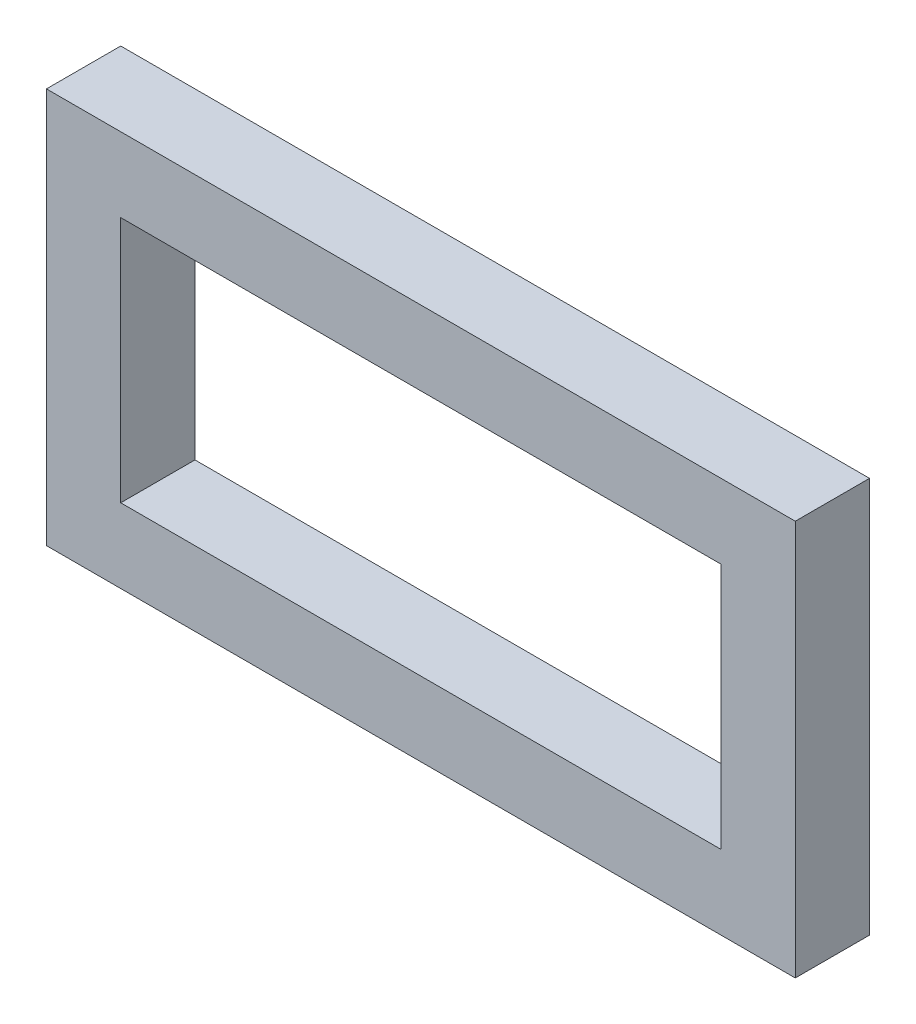
ISO-10303-21;
HEADER;
FILE_DESCRIPTION(('STEP AP214'),'2;1');
FILE_NAME('part.step','',(''),(''),'','','');
FILE_SCHEMA(('AUTOMOTIVE_DESIGN { 1 0 10303 214 1 1 1 1 }'));
ENDSEC;
DATA;
#1=APPLICATION_CONTEXT('core data for automotive mechanical design processes');
#2=APPLICATION_PROTOCOL_DEFINITION('international standard','automotive_design',2000,#1);
#3=PRODUCT_CONTEXT('',#1,'mechanical');
#4=PRODUCT('Part','Part','',(#3));
#5=PRODUCT_RELATED_PRODUCT_CATEGORY('part','',(#4));
#6=PRODUCT_DEFINITION_FORMATION('','',#4);
#7=PRODUCT_DEFINITION_CONTEXT('part definition',#1,'design');
#8=PRODUCT_DEFINITION('design','',#6,#7);
#9=PRODUCT_DEFINITION_SHAPE('','',#8);
#10=(LENGTH_UNIT() NAMED_UNIT(*) SI_UNIT(.MILLI.,.METRE.));
#11=(NAMED_UNIT(*) PLANE_ANGLE_UNIT() SI_UNIT($,.RADIAN.));
#12=(NAMED_UNIT(*) SI_UNIT($,.STERADIAN.) SOLID_ANGLE_UNIT());
#13=UNCERTAINTY_MEASURE_WITH_UNIT(LENGTH_MEASURE(1.E-05),#10,'distance_accuracy_value','');
#14=(GEOMETRIC_REPRESENTATION_CONTEXT(3) GLOBAL_UNCERTAINTY_ASSIGNED_CONTEXT((#13)) GLOBAL_UNIT_ASSIGNED_CONTEXT((#10,
#11,#12)) REPRESENTATION_CONTEXT('',''));
#15=CARTESIAN_POINT('',(0.,0.,0.));
#16=DIRECTION('',(0.,0.,1.));
#17=DIRECTION('',(1.,0.,0.));
#18=AXIS2_PLACEMENT_3D('',#15,#16,#17);
#19=CARTESIAN_POINT('',(0.,7.44800043106079,0.));
#20=DIRECTION('',(-1.,0.,0.));
#21=DIRECTION('',(0.,-1.,0.));
#22=AXIS2_PLACEMENT_3D('',#19,#20,#21);
#23=PLANE('',#22);
#24=DIRECTION('',(0.,-1.,0.));
#25=VECTOR('',#24,1.);
#26=CARTESIAN_POINT('',(0.,7.44800043106079,1.39800012111664));
#27=LINE('',#26,#25);
#28=CARTESIAN_POINT('',(0.,7.44800043106079,1.39800012111664));
#29=VERTEX_POINT('',#28);
#30=CARTESIAN_POINT('',(0.,0.,1.39800012111664));
#31=VERTEX_POINT('',#30);
#32=EDGE_CURVE('E138',#29,#31,#27,.T.);
#33=ORIENTED_EDGE('',*,*,#32,.F.);
#34=DIRECTION('',(0.,0.,1.));
#35=VECTOR('',#34,1.);
#36=CARTESIAN_POINT('',(0.,7.44800043106079,0.));
#37=LINE('',#36,#35);
#38=CARTESIAN_POINT('',(0.,7.44800043106079,0.));
#39=VERTEX_POINT('',#38);
#40=EDGE_CURVE('E11',#39,#29,#37,.T.);
#41=ORIENTED_EDGE('',*,*,#40,.F.);
#42=DIRECTION('',(0.,-1.,0.));
#43=VECTOR('',#42,1.);
#44=CARTESIAN_POINT('',(0.,7.44800043106079,0.));
#45=LINE('',#44,#43);
#46=CARTESIAN_POINT('',(0.,0.,0.));
#47=VERTEX_POINT('',#46);
#48=EDGE_CURVE('E142',#39,#47,#45,.T.);
#49=ORIENTED_EDGE('',*,*,#48,.T.);
#50=DIRECTION('',(0.,0.,1.));
#51=VECTOR('',#50,1.);
#52=CARTESIAN_POINT('',(0.,0.,0.));
#53=LINE('',#52,#51);
#54=EDGE_CURVE('E43',#47,#31,#53,.T.);
#55=ORIENTED_EDGE('',*,*,#54,.T.);
#56=EDGE_LOOP('',(#33,#41,#49,#55));
#57=FACE_BOUND('',#56,.T.);
#58=ADVANCED_FACE('F40',(#57),#23,.T.);
#59=CARTESIAN_POINT('',(14.0980005264282,7.44800043106079,0.));
#60=DIRECTION('',(0.,1.,0.));
#61=DIRECTION('',(0.,0.,1.));
#62=AXIS2_PLACEMENT_3D('',#59,#60,#61);
#63=PLANE('',#62);
#64=DIRECTION('',(-1.,0.,0.));
#65=VECTOR('',#64,1.);
#66=CARTESIAN_POINT('',(14.0980005264282,7.44800043106079,1.39800012111664));
#67=LINE('',#66,#65);
#68=CARTESIAN_POINT('',(14.0980005264282,7.44800043106079,1.39800012111664));
#69=VERTEX_POINT('',#68);
#70=EDGE_CURVE('E146',#69,#29,#67,.T.);
#71=ORIENTED_EDGE('',*,*,#70,.F.);
#72=DIRECTION('',(0.,0.,1.));
#73=VECTOR('',#72,1.);
#74=CARTESIAN_POINT('',(14.0980005264282,7.44800043106079,0.));
#75=LINE('',#74,#73);
#76=CARTESIAN_POINT('',(14.0980005264282,7.44800043106079,0.));
#77=VERTEX_POINT('',#76);
#78=EDGE_CURVE('E48',#77,#69,#75,.T.);
#79=ORIENTED_EDGE('',*,*,#78,.F.);
#80=DIRECTION('',(-1.,0.,0.));
#81=VECTOR('',#80,1.);
#82=CARTESIAN_POINT('',(14.0980005264282,7.44800043106079,0.));
#83=LINE('',#82,#81);
#84=EDGE_CURVE('E152',#77,#39,#83,.T.);
#85=ORIENTED_EDGE('',*,*,#84,.T.);
#86=ORIENTED_EDGE('',*,*,#40,.T.);
#87=EDGE_LOOP('',(#71,#79,#85,#86));
#88=FACE_BOUND('',#87,.T.);
#89=ADVANCED_FACE('F178',(#88),#63,.T.);
#90=CARTESIAN_POINT('',(14.0980005264282,0.,0.));
#91=DIRECTION('',(1.,0.,0.));
#92=DIRECTION('',(0.,0.,-1.));
#93=AXIS2_PLACEMENT_3D('',#90,#91,#92);
#94=PLANE('',#93);
#95=DIRECTION('',(0.,1.,0.));
#96=VECTOR('',#95,1.);
#97=CARTESIAN_POINT('',(14.0980005264282,0.,1.39800012111664));
#98=LINE('',#97,#96);
#99=CARTESIAN_POINT('',(14.0980005264282,0.,1.39800012111664));
#100=VERTEX_POINT('',#99);
#101=EDGE_CURVE('E160',#100,#69,#98,.T.);
#102=ORIENTED_EDGE('',*,*,#101,.F.);
#103=DIRECTION('',(0.,0.,1.));
#104=VECTOR('',#103,1.);
#105=CARTESIAN_POINT('',(14.0980005264282,0.,0.));
#106=LINE('',#105,#104);
#107=CARTESIAN_POINT('',(14.0980005264282,0.,0.));
#108=VERTEX_POINT('',#107);
#109=EDGE_CURVE('E165',#108,#100,#106,.T.);
#110=ORIENTED_EDGE('',*,*,#109,.F.);
#111=DIRECTION('',(0.,1.,0.));
#112=VECTOR('',#111,1.);
#113=CARTESIAN_POINT('',(14.0980005264282,0.,0.));
#114=LINE('',#113,#112);
#115=EDGE_CURVE('E149',#108,#77,#114,.T.);
#116=ORIENTED_EDGE('',*,*,#115,.T.);
#117=ORIENTED_EDGE('',*,*,#78,.T.);
#118=EDGE_LOOP('',(#102,#110,#116,#117));
#119=FACE_BOUND('',#118,.T.);
#120=ADVANCED_FACE('F182',(#119),#94,.T.);
#121=CARTESIAN_POINT('',(0.,0.,0.));
#122=DIRECTION('',(0.,-1.,0.));
#123=DIRECTION('',(1.,0.,0.));
#124=AXIS2_PLACEMENT_3D('',#121,#122,#123);
#125=PLANE('',#124);
#126=DIRECTION('',(1.,0.,0.));
#127=VECTOR('',#126,1.);
#128=CARTESIAN_POINT('',(0.,0.,1.39800012111664));
#129=LINE('',#128,#127);
#130=EDGE_CURVE('E157',#31,#100,#129,.T.);
#131=ORIENTED_EDGE('',*,*,#130,.F.);
#132=ORIENTED_EDGE('',*,*,#54,.F.);
#133=DIRECTION('',(1.,0.,0.));
#134=VECTOR('',#133,1.);
#135=CARTESIAN_POINT('',(0.,0.,0.));
#136=LINE('',#135,#134);
#137=EDGE_CURVE('E145',#47,#108,#136,.T.);
#138=ORIENTED_EDGE('',*,*,#137,.T.);
#139=ORIENTED_EDGE('',*,*,#109,.T.);
#140=EDGE_LOOP('',(#131,#132,#138,#139));
#141=FACE_BOUND('',#140,.T.);
#142=ADVANCED_FACE('F173',(#141),#125,.T.);
#143=CARTESIAN_POINT('',(0.,0.,0.));
#144=DIRECTION('',(0.,0.,1.));
#145=DIRECTION('',(1.,0.,0.));
#146=AXIS2_PLACEMENT_3D('',#143,#144,#145);
#147=PLANE('',#146);
#148=DIRECTION('',(-1.,0.,0.));
#149=VECTOR('',#148,1.);
#150=CARTESIAN_POINT('',(1.39800012111664,6.04800033569336,0.));
#151=LINE('',#150,#149);
#152=CARTESIAN_POINT('',(12.6980009078979,6.04800033569336,0.));
#153=VERTEX_POINT('',#152);
#154=CARTESIAN_POINT('',(1.39800012111664,6.04800033569336,0.));
#155=VERTEX_POINT('',#154);
#156=EDGE_CURVE('E113',#153,#155,#151,.T.);
#157=ORIENTED_EDGE('',*,*,#156,.T.);
#158=DIRECTION('',(0.,-1.,0.));
#159=VECTOR('',#158,1.);
#160=CARTESIAN_POINT('',(1.39800012111664,1.39800012111664,0.));
#161=LINE('',#160,#159);
#162=CARTESIAN_POINT('',(1.39800012111664,1.39800012111664,0.));
#163=VERTEX_POINT('',#162);
#164=EDGE_CURVE('E107',#155,#163,#161,.T.);
#165=ORIENTED_EDGE('',*,*,#164,.T.);
#166=DIRECTION('',(1.,0.,0.));
#167=VECTOR('',#166,1.);
#168=CARTESIAN_POINT('',(12.6980009078979,1.39800012111664,0.));
#169=LINE('',#168,#167);
#170=CARTESIAN_POINT('',(12.6980009078979,1.39800012111664,0.));
#171=VERTEX_POINT('',#170);
#172=EDGE_CURVE('E116',#163,#171,#169,.T.);
#173=ORIENTED_EDGE('',*,*,#172,.T.);
#174=DIRECTION('',(0.,1.,0.));
#175=VECTOR('',#174,1.);
#176=CARTESIAN_POINT('',(12.6980009078979,6.04800033569336,0.));
#177=LINE('',#176,#175);
#178=EDGE_CURVE('E56',#171,#153,#177,.T.);
#179=ORIENTED_EDGE('',*,*,#178,.T.);
#180=EDGE_LOOP('',(#157,#165,#173,#179));
#181=FACE_BOUND('',#180,.T.);
#182=ORIENTED_EDGE('',*,*,#48,.F.);
#183=ORIENTED_EDGE('',*,*,#84,.F.);
#184=ORIENTED_EDGE('',*,*,#115,.F.);
#185=ORIENTED_EDGE('',*,*,#137,.F.);
#186=EDGE_LOOP('',(#182,#183,#184,#185));
#187=FACE_BOUND('',#186,.T.);
#188=ADVANCED_FACE('F120',(#181,#187),#147,.F.);
#189=CARTESIAN_POINT('',(0.,0.,1.39800012111664));
#190=DIRECTION('',(0.,0.,1.));
#191=DIRECTION('',(1.,0.,0.));
#192=AXIS2_PLACEMENT_3D('',#189,#190,#191);
#193=PLANE('',#192);
#194=DIRECTION('',(0.,-1.,0.));
#195=VECTOR('',#194,1.);
#196=CARTESIAN_POINT('',(1.39800012111664,1.39800012111664,1.39800012111664));
#197=LINE('',#196,#195);
#198=CARTESIAN_POINT('',(1.39800012111664,6.04800033569336,1.39800012111664));
#199=VERTEX_POINT('',#198);
#200=CARTESIAN_POINT('',(1.39800012111664,1.39800012111664,1.39800012111664));
#201=VERTEX_POINT('',#200);
#202=EDGE_CURVE('E64',#199,#201,#197,.T.);
#203=ORIENTED_EDGE('',*,*,#202,.F.);
#204=DIRECTION('',(-1.,0.,0.));
#205=VECTOR('',#204,1.);
#206=CARTESIAN_POINT('',(1.39800012111664,6.04800033569336,1.39800012111664));
#207=LINE('',#206,#205);
#208=CARTESIAN_POINT('',(12.6980009078979,6.04800033569336,1.39800012111664));
#209=VERTEX_POINT('',#208);
#210=EDGE_CURVE('E123',#209,#199,#207,.T.);
#211=ORIENTED_EDGE('',*,*,#210,.F.);
#212=DIRECTION('',(0.,1.,0.));
#213=VECTOR('',#212,1.);
#214=CARTESIAN_POINT('',(12.6980009078979,6.04800033569336,1.39800012111664));
#215=LINE('',#214,#213);
#216=CARTESIAN_POINT('',(12.6980009078979,1.39800012111664,1.39800012111664));
#217=VERTEX_POINT('',#216);
#218=EDGE_CURVE('E126',#217,#209,#215,.T.);
#219=ORIENTED_EDGE('',*,*,#218,.F.);
#220=DIRECTION('',(1.,0.,0.));
#221=VECTOR('',#220,1.);
#222=CARTESIAN_POINT('',(12.6980009078979,1.39800012111664,1.39800012111664));
#223=LINE('',#222,#221);
#224=EDGE_CURVE('E132',#201,#217,#223,.T.);
#225=ORIENTED_EDGE('',*,*,#224,.F.);
#226=EDGE_LOOP('',(#203,#211,#219,#225));
#227=FACE_BOUND('',#226,.T.);
#228=ORIENTED_EDGE('',*,*,#32,.T.);
#229=ORIENTED_EDGE('',*,*,#130,.T.);
#230=ORIENTED_EDGE('',*,*,#101,.T.);
#231=ORIENTED_EDGE('',*,*,#70,.T.);
#232=EDGE_LOOP('',(#228,#229,#230,#231));
#233=FACE_BOUND('',#232,.T.);
#234=ADVANCED_FACE('F175',(#227,#233),#193,.T.);
#235=CARTESIAN_POINT('',(1.39800012111664,1.39800012111664,0.));
#236=DIRECTION('',(-1.,0.,0.));
#237=DIRECTION('',(0.,-1.,0.));
#238=AXIS2_PLACEMENT_3D('',#235,#236,#237);
#239=PLANE('',#238);
#240=ORIENTED_EDGE('',*,*,#202,.T.);
#241=DIRECTION('',(0.,0.,1.));
#242=VECTOR('',#241,1.);
#243=CARTESIAN_POINT('',(1.39800012111664,1.39800012111664,0.));
#244=LINE('',#243,#242);
#245=EDGE_CURVE('E103',#163,#201,#244,.T.);
#246=ORIENTED_EDGE('',*,*,#245,.F.);
#247=ORIENTED_EDGE('',*,*,#164,.F.);
#248=DIRECTION('',(0.,0.,1.));
#249=VECTOR('',#248,1.);
#250=CARTESIAN_POINT('',(1.39800012111664,6.04800033569336,0.));
#251=LINE('',#250,#249);
#252=EDGE_CURVE('E136',#155,#199,#251,.T.);
#253=ORIENTED_EDGE('',*,*,#252,.T.);
#254=EDGE_LOOP('',(#240,#246,#247,#253));
#255=FACE_BOUND('',#254,.T.);
#256=ADVANCED_FACE('F105',(#255),#239,.F.);
#257=CARTESIAN_POINT('',(1.39800012111664,6.04800033569336,0.));
#258=DIRECTION('',(0.,1.,0.));
#259=DIRECTION('',(0.,0.,1.));
#260=AXIS2_PLACEMENT_3D('',#257,#258,#259);
#261=PLANE('',#260);
#262=ORIENTED_EDGE('',*,*,#210,.T.);
#263=ORIENTED_EDGE('',*,*,#252,.F.);
#264=ORIENTED_EDGE('',*,*,#156,.F.);
#265=DIRECTION('',(0.,0.,1.));
#266=VECTOR('',#265,1.);
#267=CARTESIAN_POINT('',(12.6980009078979,6.04800033569336,0.));
#268=LINE('',#267,#266);
#269=EDGE_CURVE('E139',#153,#209,#268,.T.);
#270=ORIENTED_EDGE('',*,*,#269,.T.);
#271=EDGE_LOOP('',(#262,#263,#264,#270));
#272=FACE_BOUND('',#271,.T.);
#273=ADVANCED_FACE('F233',(#272),#261,.F.);
#274=CARTESIAN_POINT('',(12.6980009078979,6.04800033569336,0.));
#275=DIRECTION('',(1.,0.,0.));
#276=DIRECTION('',(0.,0.,-1.));
#277=AXIS2_PLACEMENT_3D('',#274,#275,#276);
#278=PLANE('',#277);
#279=ORIENTED_EDGE('',*,*,#218,.T.);
#280=ORIENTED_EDGE('',*,*,#269,.F.);
#281=ORIENTED_EDGE('',*,*,#178,.F.);
#282=DIRECTION('',(0.,0.,1.));
#283=VECTOR('',#282,1.);
#284=CARTESIAN_POINT('',(12.6980009078979,1.39800012111664,0.));
#285=LINE('',#284,#283);
#286=EDGE_CURVE('E112',#171,#217,#285,.T.);
#287=ORIENTED_EDGE('',*,*,#286,.T.);
#288=EDGE_LOOP('',(#279,#280,#281,#287));
#289=FACE_BOUND('',#288,.T.);
#290=ADVANCED_FACE('F242',(#289),#278,.F.);
#291=CARTESIAN_POINT('',(12.6980009078979,1.39800012111664,0.));
#292=DIRECTION('',(0.,-1.,0.));
#293=DIRECTION('',(0.,0.,-1.));
#294=AXIS2_PLACEMENT_3D('',#291,#292,#293);
#295=PLANE('',#294);
#296=ORIENTED_EDGE('',*,*,#224,.T.);
#297=ORIENTED_EDGE('',*,*,#286,.F.);
#298=ORIENTED_EDGE('',*,*,#172,.F.);
#299=ORIENTED_EDGE('',*,*,#245,.T.);
#300=EDGE_LOOP('',(#296,#297,#298,#299));
#301=FACE_BOUND('',#300,.T.);
#302=ADVANCED_FACE('F117',(#301),#295,.F.);
#303=CLOSED_SHELL('',(#58,#89,#120,#142,#188,#234,#256,#273,#290,#302));
#304=MANIFOLD_SOLID_BREP('B2',#303);
#305=ADVANCED_BREP_SHAPE_REPRESENTATION('',(#18,#304),#14);
#306=SHAPE_DEFINITION_REPRESENTATION(#9,#305);
ENDSEC;
END-ISO-10303-21;
